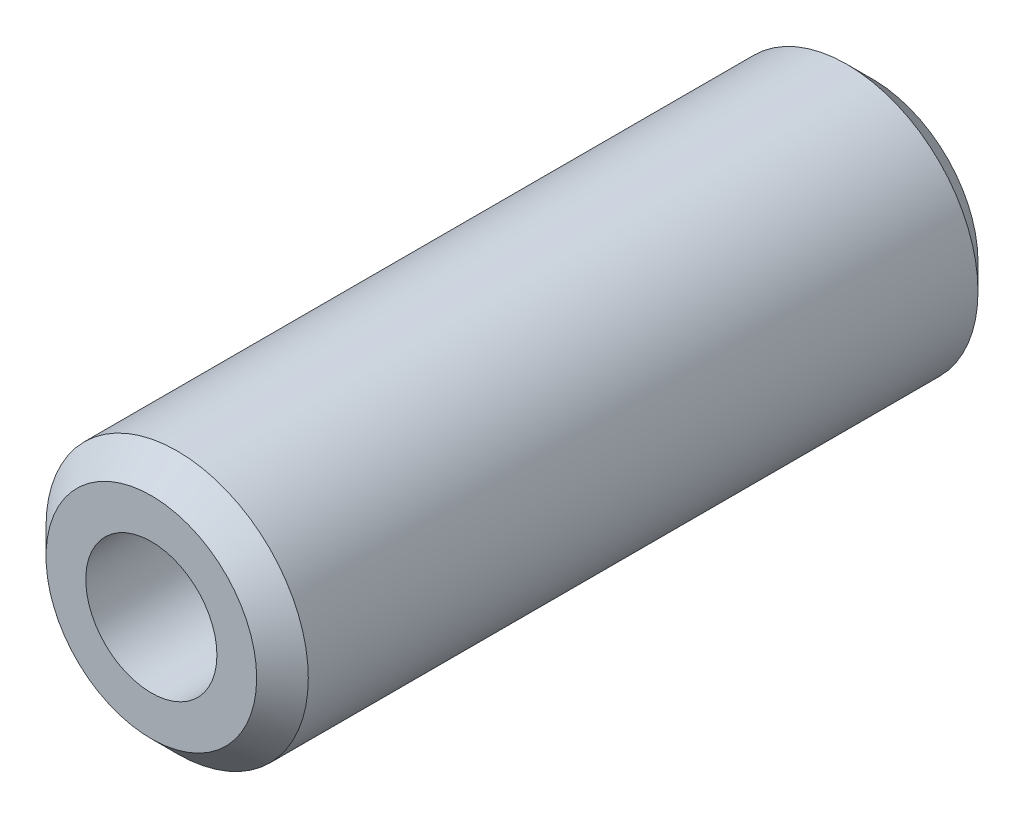
ISO-10303-21;
HEADER;
FILE_DESCRIPTION(('STEP AP214'),'2;1');
FILE_NAME('part.step','',(''),(''),'','','');
FILE_SCHEMA(('AUTOMOTIVE_DESIGN { 1 0 10303 214 1 1 1 1 }'));
ENDSEC;
DATA;
#1=APPLICATION_CONTEXT('core data for automotive mechanical design processes');
#2=APPLICATION_PROTOCOL_DEFINITION('international standard','automotive_design',2000,#1);
#3=PRODUCT_CONTEXT('',#1,'mechanical');
#4=PRODUCT('Part','Part','',(#3));
#5=PRODUCT_RELATED_PRODUCT_CATEGORY('part','',(#4));
#6=PRODUCT_DEFINITION_FORMATION('','',#4);
#7=PRODUCT_DEFINITION_CONTEXT('part definition',#1,'design');
#8=PRODUCT_DEFINITION('design','',#6,#7);
#9=PRODUCT_DEFINITION_SHAPE('','',#8);
#10=(LENGTH_UNIT() NAMED_UNIT(*) SI_UNIT(.MILLI.,.METRE.));
#11=(NAMED_UNIT(*) PLANE_ANGLE_UNIT() SI_UNIT($,.RADIAN.));
#12=(NAMED_UNIT(*) SI_UNIT($,.STERADIAN.) SOLID_ANGLE_UNIT());
#13=UNCERTAINTY_MEASURE_WITH_UNIT(LENGTH_MEASURE(1.E-05),#10,'distance_accuracy_value','');
#14=(GEOMETRIC_REPRESENTATION_CONTEXT(3) GLOBAL_UNCERTAINTY_ASSIGNED_CONTEXT((#13)) GLOBAL_UNIT_ASSIGNED_CONTEXT((#10,
#11,#12)) REPRESENTATION_CONTEXT('',''));
#15=CARTESIAN_POINT('',(0.,0.,0.));
#16=DIRECTION('',(0.,0.,1.));
#17=DIRECTION('',(1.,0.,0.));
#18=AXIS2_PLACEMENT_3D('',#15,#16,#17);
#19=CARTESIAN_POINT('',(0.,0.,34.925));
#20=DIRECTION('',(0.,0.,1.));
#21=DIRECTION('',(1.,0.,0.));
#22=AXIS2_PLACEMENT_3D('',#19,#20,#21);
#23=PLANE('',#22);
#24=CARTESIAN_POINT('',(0.,0.,34.925));
#25=DIRECTION('',(0.,0.,1.));
#26=DIRECTION('',(1.,0.,0.));
#27=AXIS2_PLACEMENT_3D('',#24,#25,#26);
#28=CIRCLE('',#27,10.2);
#29=CARTESIAN_POINT('',(10.2,0.,34.925));
#30=VERTEX_POINT('',#29);
#31=EDGE_CURVE('E10',#30,#30,#28,.T.);
#32=ORIENTED_EDGE('',*,*,#31,.T.);
#33=EDGE_LOOP('',(#32));
#34=FACE_BOUND('',#33,.T.);
#35=CARTESIAN_POINT('',(0.,0.,34.925));
#36=DIRECTION('',(0.,0.,1.));
#37=DIRECTION('',(1.,0.,0.));
#38=AXIS2_PLACEMENT_3D('',#35,#36,#37);
#39=CIRCLE('',#38,6.35);
#40=CARTESIAN_POINT('',(6.35,0.,34.925));
#41=VERTEX_POINT('',#40);
#42=EDGE_CURVE('E51',#41,#41,#39,.T.);
#43=ORIENTED_EDGE('',*,*,#42,.F.);
#44=EDGE_LOOP('',(#43));
#45=FACE_BOUND('',#44,.T.);
#46=ADVANCED_FACE('F31',(#34,#45),#23,.T.);
#47=CARTESIAN_POINT('',(0.,0.,-34.925));
#48=DIRECTION('',(0.,0.,1.));
#49=DIRECTION('',(1.,0.,0.));
#50=AXIS2_PLACEMENT_3D('',#47,#48,#49);
#51=PLANE('',#50);
#52=CARTESIAN_POINT('',(0.,0.,-34.925));
#53=DIRECTION('',(0.,0.,1.));
#54=DIRECTION('',(1.,0.,0.));
#55=AXIS2_PLACEMENT_3D('',#52,#53,#54);
#56=CIRCLE('',#55,10.2);
#57=CARTESIAN_POINT('',(10.2,0.,-34.925));
#58=VERTEX_POINT('',#57);
#59=EDGE_CURVE('E38',#58,#58,#56,.F.);
#60=ORIENTED_EDGE('',*,*,#59,.T.);
#61=EDGE_LOOP('',(#60));
#62=FACE_BOUND('',#61,.T.);
#63=CARTESIAN_POINT('',(0.,0.,-34.925));
#64=DIRECTION('',(0.,0.,1.));
#65=DIRECTION('',(1.,0.,0.));
#66=AXIS2_PLACEMENT_3D('',#63,#64,#65);
#67=CIRCLE('',#66,6.35);
#68=CARTESIAN_POINT('',(6.35,0.,-34.925));
#69=VERTEX_POINT('',#68);
#70=EDGE_CURVE('E52',#69,#69,#67,.T.);
#71=ORIENTED_EDGE('',*,*,#70,.T.);
#72=EDGE_LOOP('',(#71));
#73=FACE_BOUND('',#72,.T.);
#74=ADVANCED_FACE('F62',(#62,#73),#51,.F.);
#75=CARTESIAN_POINT('',(0.,0.,34.925));
#76=DIRECTION('',(0.,0.,-1.));
#77=DIRECTION('',(-1.,0.,0.));
#78=AXIS2_PLACEMENT_3D('',#75,#76,#77);
#79=CYLINDRICAL_SURFACE('',#78,12.7);
#80=CARTESIAN_POINT('',(0.,0.,-32.425));
#81=DIRECTION('',(0.,0.,1.));
#82=DIRECTION('',(1.,0.,0.));
#83=AXIS2_PLACEMENT_3D('',#80,#81,#82);
#84=CIRCLE('',#83,12.7);
#85=CARTESIAN_POINT('',(12.7,0.,-32.425));
#86=VERTEX_POINT('',#85);
#87=EDGE_CURVE('E42',#86,#86,#84,.T.);
#88=ORIENTED_EDGE('',*,*,#87,.T.);
#89=EDGE_LOOP('',(#88));
#90=FACE_BOUND('',#89,.T.);
#91=CARTESIAN_POINT('',(0.,0.,32.425));
#92=DIRECTION('',(0.,0.,1.));
#93=DIRECTION('',(1.,0.,0.));
#94=AXIS2_PLACEMENT_3D('',#91,#92,#93);
#95=CIRCLE('',#94,12.7);
#96=CARTESIAN_POINT('',(12.7,0.,32.425));
#97=VERTEX_POINT('',#96);
#98=EDGE_CURVE('E46',#97,#97,#95,.F.);
#99=ORIENTED_EDGE('',*,*,#98,.T.);
#100=EDGE_LOOP('',(#99));
#101=FACE_BOUND('',#100,.T.);
#102=ADVANCED_FACE('F67',(#90,#101),#79,.T.);
#103=CARTESIAN_POINT('',(0.,0.,34.925));
#104=DIRECTION('',(0.,0.,-1.));
#105=DIRECTION('',(-1.,0.,0.));
#106=AXIS2_PLACEMENT_3D('',#103,#104,#105);
#107=CYLINDRICAL_SURFACE('',#106,6.35);
#108=ORIENTED_EDGE('',*,*,#42,.T.);
#109=EDGE_LOOP('',(#108));
#110=FACE_BOUND('',#109,.T.);
#111=ORIENTED_EDGE('',*,*,#70,.F.);
#112=EDGE_LOOP('',(#111));
#113=FACE_BOUND('',#112,.T.);
#114=ADVANCED_FACE('F58',(#110,#113),#107,.F.);
#115=CARTESIAN_POINT('',(0.,0.,-32.425));
#116=DIRECTION('',(0.,0.,1.));
#117=DIRECTION('',(1.,0.,0.));
#118=AXIS2_PLACEMENT_3D('',#115,#116,#117);
#119=CONICAL_SURFACE('',#118,12.7,0.785398163397449);
#120=ORIENTED_EDGE('',*,*,#59,.F.);
#121=EDGE_LOOP('',(#120));
#122=FACE_BOUND('',#121,.T.);
#123=ORIENTED_EDGE('',*,*,#87,.F.);
#124=EDGE_LOOP('',(#123));
#125=FACE_BOUND('',#124,.T.);
#126=ADVANCED_FACE('F73',(#122,#125),#119,.T.);
#127=CARTESIAN_POINT('',(0.,0.,34.925));
#128=DIRECTION('',(0.,0.,-1.));
#129=DIRECTION('',(-1.,0.,0.));
#130=AXIS2_PLACEMENT_3D('',#127,#128,#129);
#131=CONICAL_SURFACE('',#130,10.2,0.785398163397446);
#132=ORIENTED_EDGE('',*,*,#98,.F.);
#133=EDGE_LOOP('',(#132));
#134=FACE_BOUND('',#133,.T.);
#135=ORIENTED_EDGE('',*,*,#31,.F.);
#136=EDGE_LOOP('',(#135));
#137=FACE_BOUND('',#136,.T.);
#138=ADVANCED_FACE('F33',(#134,#137),#131,.T.);
#139=CLOSED_SHELL('',(#46,#74,#102,#114,#126,#138));
#140=MANIFOLD_SOLID_BREP('B2',#139);
#141=ADVANCED_BREP_SHAPE_REPRESENTATION('',(#18,#140),#14);
#142=SHAPE_DEFINITION_REPRESENTATION(#9,#141);
ENDSEC;
END-ISO-10303-21;
